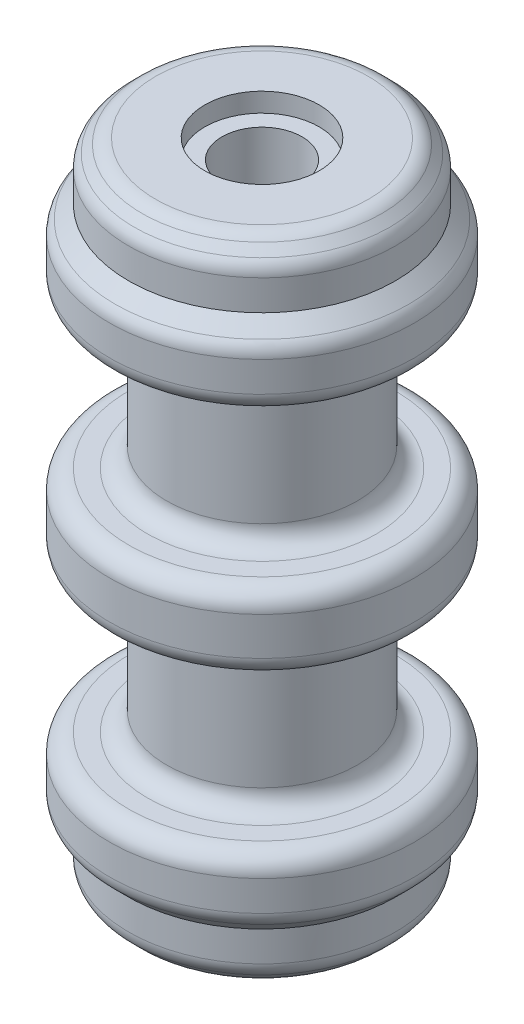
ISO-10303-21;
HEADER;
FILE_DESCRIPTION(('STEP AP214'),'2;1');
FILE_NAME('part.step','',(''),(''),'','','');
FILE_SCHEMA(('AUTOMOTIVE_DESIGN { 1 0 10303 214 1 1 1 1 }'));
ENDSEC;
DATA;
#1=APPLICATION_CONTEXT('core data for automotive mechanical design processes');
#2=APPLICATION_PROTOCOL_DEFINITION('international standard','automotive_design',2000,#1);
#3=PRODUCT_CONTEXT('',#1,'mechanical');
#4=PRODUCT('Part','Part','',(#3));
#5=PRODUCT_RELATED_PRODUCT_CATEGORY('part','',(#4));
#6=PRODUCT_DEFINITION_FORMATION('','',#4);
#7=PRODUCT_DEFINITION_CONTEXT('part definition',#1,'design');
#8=PRODUCT_DEFINITION('design','',#6,#7);
#9=PRODUCT_DEFINITION_SHAPE('','',#8);
#10=(LENGTH_UNIT() NAMED_UNIT(*) SI_UNIT(.MILLI.,.METRE.));
#11=(NAMED_UNIT(*) PLANE_ANGLE_UNIT() SI_UNIT($,.RADIAN.));
#12=(NAMED_UNIT(*) SI_UNIT($,.STERADIAN.) SOLID_ANGLE_UNIT());
#13=UNCERTAINTY_MEASURE_WITH_UNIT(LENGTH_MEASURE(1.E-05),#10,'distance_accuracy_value','');
#14=(GEOMETRIC_REPRESENTATION_CONTEXT(3) GLOBAL_UNCERTAINTY_ASSIGNED_CONTEXT((#13)) GLOBAL_UNIT_ASSIGNED_CONTEXT((#10,
#11,#12)) REPRESENTATION_CONTEXT('',''));
#15=CARTESIAN_POINT('',(0.,0.,0.));
#16=DIRECTION('',(0.,0.,1.));
#17=DIRECTION('',(1.,0.,0.));
#18=AXIS2_PLACEMENT_3D('',#15,#16,#17);
#19=CARTESIAN_POINT('',(0.,9.35000000000001,0.));
#20=DIRECTION('',(0.,-1.,0.));
#21=DIRECTION('',(1.,0.,0.));
#22=AXIS2_PLACEMENT_3D('',#19,#20,#21);
#23=CYLINDRICAL_SURFACE('',#22,4.);
#24=CARTESIAN_POINT('',(0.,0.5,0.));
#25=DIRECTION('',(0.,1.,0.));
#26=DIRECTION('',(-1.,0.,0.));
#27=AXIS2_PLACEMENT_3D('',#24,#25,#26);
#28=CIRCLE('',#27,4.);
#29=CARTESIAN_POINT('',(-4.,0.500000000000001,0.));
#30=VERTEX_POINT('',#29);
#31=EDGE_CURVE('E126',#30,#30,#28,.T.);
#32=ORIENTED_EDGE('',*,*,#31,.F.);
#33=EDGE_LOOP('',(#32));
#34=FACE_BOUND('',#33,.T.);
#35=CARTESIAN_POINT('',(0.,-0.5,0.));
#36=DIRECTION('',(0.,-1.,0.));
#37=DIRECTION('',(-1.,0.,0.));
#38=AXIS2_PLACEMENT_3D('',#35,#36,#37);
#39=CIRCLE('',#38,4.);
#40=CARTESIAN_POINT('',(-4.,-0.499999999999999,0.));
#41=VERTEX_POINT('',#40);
#42=EDGE_CURVE('E118',#41,#41,#39,.T.);
#43=ORIENTED_EDGE('',*,*,#42,.F.);
#44=EDGE_LOOP('',(#43));
#45=FACE_BOUND('',#44,.T.);
#46=ADVANCED_FACE('F16',(#34,#45),#23,.T.);
#47=CARTESIAN_POINT('',(0.,0.500000000000003,0.));
#48=DIRECTION('',(0.,-1.,0.));
#49=DIRECTION('',(1.,0.,0.));
#50=AXIS2_PLACEMENT_3D('',#47,#48,#49);
#51=TOROIDAL_SURFACE('',#50,3.5,0.499999999999999);
#52=ORIENTED_EDGE('',*,*,#31,.T.);
#53=EDGE_LOOP('',(#52));
#54=FACE_BOUND('',#53,.T.);
#55=CARTESIAN_POINT('',(0.,1.,0.));
#56=DIRECTION('',(0.,-1.,0.));
#57=DIRECTION('',(1.,0.,0.));
#58=AXIS2_PLACEMENT_3D('',#55,#56,#57);
#59=CIRCLE('',#58,3.5);
#60=CARTESIAN_POINT('',(3.5,1.,0.));
#61=VERTEX_POINT('',#60);
#62=EDGE_CURVE('E20',#61,#61,#59,.T.);
#63=ORIENTED_EDGE('',*,*,#62,.T.);
#64=EDGE_LOOP('',(#63));
#65=FACE_BOUND('',#64,.T.);
#66=ADVANCED_FACE('F558',(#54,#65),#51,.T.);
#67=CARTESIAN_POINT('',(0.,-0.500000000000003,0.));
#68=DIRECTION('',(0.,-1.,0.));
#69=DIRECTION('',(1.,0.,0.));
#70=AXIS2_PLACEMENT_3D('',#67,#68,#69);
#71=TOROIDAL_SURFACE('',#70,3.5,0.499999999999999);
#72=CARTESIAN_POINT('',(3.5,-1.,0.));
#73=CARTESIAN_POINT('',(3.49979766502808,-1.,0.667629423048145));
#74=CARTESIAN_POINT('',(3.2542590537185,-1.,1.28833148346657));
#75=CARTESIAN_POINT('',(2.98797828120489,-1.,1.96146807598652));
#76=CARTESIAN_POINT('',(2.47487373415291,-1.,2.47487373415292));
#77=CARTESIAN_POINT('',(1.96321095052489,-1.,2.98683678280856));
#78=CARTESIAN_POINT('',(1.28833148346655,-1.,3.25425905371851));
#79=CARTESIAN_POINT('',(0.668661707717994,-1.,3.4998043795635));
#80=CARTESIAN_POINT('',(0.,-1.,3.5));
#81=CARTESIAN_POINT('',(-0.666624940616947,-1.,3.50019502456976));
#82=CARTESIAN_POINT('',(-1.28833148346656,-1.,3.2542590537185));
#83=CARTESIAN_POINT('',(-1.96146808368726,-1.,2.9879782735099));
#84=CARTESIAN_POINT('',(-2.47487373415292,-1.,2.47487373415292));
#85=CARTESIAN_POINT('',(-2.98683669963696,-0.999999999999999,1.96321103364648));
#86=CARTESIAN_POINT('',(-3.2542590537185,-0.999999999999999,1.28833148346656));
#87=CARTESIAN_POINT('',(-3.49979734676479,-0.999999999999999,0.668679572420675));
#88=CARTESIAN_POINT('',(-3.5,-0.999999999999999,0.));
#89=B_SPLINE_CURVE_WITH_KNOTS('',2,(#72,#73,#74,#75,#76,#77,#78,#79,#80,#81,#82,#83,#84,#85,#86,
#87,#88),.UNSPECIFIED.,.F.,.F.,(3,2,2,2,2,2,2,2,3),(0.,0.125,0.25,0.375,0.5,0.625,0.75,0.875,
1.),.UNSPECIFIED.);
#90=CARTESIAN_POINT('',(3.5,-1.,0.));
#91=VERTEX_POINT('',#90);
#92=CARTESIAN_POINT('',(-3.5,-0.999999999999999,0.));
#93=VERTEX_POINT('',#92);
#94=EDGE_CURVE('E62',#91,#93,#89,.T.);
#95=ORIENTED_EDGE('',*,*,#94,.F.);
#96=CARTESIAN_POINT('',(-3.5,-0.999999999999999,0.));
#97=CARTESIAN_POINT('',(-3.49979766502809,-0.999999999999999,-0.667629423043126));
#98=CARTESIAN_POINT('',(-3.25425905371851,-0.999999999999999,-1.28833148346654));
#99=CARTESIAN_POINT('',(-2.98797828120803,-0.999999999999999,-1.96146807598399));
#100=CARTESIAN_POINT('',(-2.47487373415293,-1.,-2.4748737341529));
#101=CARTESIAN_POINT('',(-1.96321095052301,-1.,-2.98683678280983));
#102=CARTESIAN_POINT('',(-1.28833148346658,-1.,-3.2542590537185));
#103=CARTESIAN_POINT('',(-0.668661707717505,-1.,-3.49980437956322));
#104=CARTESIAN_POINT('',(0.,-1.,-3.5));
#105=CARTESIAN_POINT('',(0.666624940611165,-1.,-3.50019502457004));
#106=CARTESIAN_POINT('',(1.28833148346653,-1.,-3.25425905371852));
#107=CARTESIAN_POINT('',(1.9614680836811,-1.,-2.98797827351451));
#108=CARTESIAN_POINT('',(2.4748737341529,-1.,-2.47487373415293));
#109=CARTESIAN_POINT('',(2.98683669963715,-1.,-1.96321103364783));
#110=CARTESIAN_POINT('',(3.2542590537185,-1.,-1.28833148346657));
#111=CARTESIAN_POINT('',(3.49979734676479,-1.,-0.668679572418987));
#112=CARTESIAN_POINT('',(3.5,-1.,0.));
#113=B_SPLINE_CURVE_WITH_KNOTS('',2,(#96,#97,#98,#99,#100,#101,#102,#103,#104,#105,#106,#107,
#108,#109,#110,#111,#112),.UNSPECIFIED.,.F.,.F.,(3,2,2,2,2,2,2,2,3),(0.,0.125,0.25,0.375,0.5,
0.625,0.75,0.875,1.),.UNSPECIFIED.);
#114=EDGE_CURVE('E60',#93,#91,#113,.T.);
#115=ORIENTED_EDGE('',*,*,#114,.F.);
#116=EDGE_LOOP('',(#95,#115));
#117=FACE_BOUND('',#116,.T.);
#118=ORIENTED_EDGE('',*,*,#42,.T.);
#119=EDGE_LOOP('',(#118));
#120=FACE_BOUND('',#119,.T.);
#121=ADVANCED_FACE('F67',(#117,#120),#71,.T.);
#122=CARTESIAN_POINT('',(0.,1.,0.));
#123=DIRECTION('',(0.,-1.,0.));
#124=DIRECTION('',(1.,0.,0.));
#125=AXIS2_PLACEMENT_3D('',#122,#123,#124);
#126=PLANE('',#125);
#127=ORIENTED_EDGE('',*,*,#62,.F.);
#128=EDGE_LOOP('',(#127));
#129=FACE_BOUND('',#128,.T.);
#130=CARTESIAN_POINT('',(3.,0.999999999999999,0.));
#131=CARTESIAN_POINT('',(2.99979767576665,0.999999999999999,-0.572217428980286));
#132=CARTESIAN_POINT('',(2.78936490318729,1.,-1.10428412868562));
#133=CARTESIAN_POINT('',(2.56123034916773,1.,-1.68110872572008));
#134=CARTESIAN_POINT('',(2.12132034355965,1.,-2.12132034355963));
#135=CARTESIAN_POINT('',(1.68284906346665,1.,-2.56009224946141));
#136=CARTESIAN_POINT('',(1.10428412868563,1.,-2.78936490318728));
#137=CARTESIAN_POINT('',(0.573245088886783,1.,-2.99980408221013));
#138=CARTESIAN_POINT('',(0.,1.,-3.));
#139=CARTESIAN_POINT('',(-0.571213563804047,1.,-3.0001952234762));
#140=CARTESIAN_POINT('',(-1.10428412868561,1.,-2.7893649031873));
#141=CARTESIAN_POINT('',(-1.68110965453608,1.,-2.56122942098731));
#142=CARTESIAN_POINT('',(-2.12132034355964,1.,-2.12132034355965));
#143=CARTESIAN_POINT('',(-2.56009224946223,1.,-1.68284906346662));
#144=CARTESIAN_POINT('',(-2.78936490318729,1.,-1.10428412868562));
#145=CARTESIAN_POINT('',(-2.99979730636164,1.,-0.57326218760241));
#146=CARTESIAN_POINT('',(-3.,1.,0.));
#147=B_SPLINE_CURVE_WITH_KNOTS('',2,(#130,#131,#132,#133,#134,#135,#136,#137,#138,#139,#140,
#141,#142,#143,#144,#145,#146),.UNSPECIFIED.,.F.,.F.,(3,2,2,2,2,2,2,2,3),(0.,0.125,0.25,0.375,
0.5,0.625,0.75,0.875,1.),.UNSPECIFIED.);
#148=CARTESIAN_POINT('',(-3.,1.,0.));
#149=VERTEX_POINT('',#148);
#150=CARTESIAN_POINT('',(3.,0.999999999999999,0.));
#151=VERTEX_POINT('',#150);
#152=EDGE_CURVE('E69',#149,#151,#147,.F.);
#153=ORIENTED_EDGE('',*,*,#152,.T.);
#154=CARTESIAN_POINT('',(-3.,1.,0.));
#155=CARTESIAN_POINT('',(-2.99979767576666,1.,0.572217428980556));
#156=CARTESIAN_POINT('',(-2.78936490318729,1.,1.10428412868562));
#157=CARTESIAN_POINT('',(-2.56123034916822,1.,1.68110872571853));
#158=CARTESIAN_POINT('',(-2.12132034355965,1.,2.12132034355964));
#159=CARTESIAN_POINT('',(-1.68284906346669,1.,2.56009224946243));
#160=CARTESIAN_POINT('',(-1.10428412868563,1.,2.78936490318729));
#161=CARTESIAN_POINT('',(-0.573245088884399,1.,2.99980408221012));
#162=CARTESIAN_POINT('',(0.,1.,3.));
#163=CARTESIAN_POINT('',(0.571213563804764,1.,3.0001952234762));
#164=CARTESIAN_POINT('',(1.10428412868561,1.,2.78936490318729));
#165=CARTESIAN_POINT('',(1.68110965453616,1.,2.56122942098697));
#166=CARTESIAN_POINT('',(2.12132034355964,1.,2.12132034355965));
#167=CARTESIAN_POINT('',(2.56009224946023,1.,1.68284906346889));
#168=CARTESIAN_POINT('',(2.78936490318729,1.,1.10428412868562));
#169=CARTESIAN_POINT('',(2.99979730636164,0.999999999999999,0.573262187604982));
#170=CARTESIAN_POINT('',(3.,0.999999999999999,0.));
#171=B_SPLINE_CURVE_WITH_KNOTS('',2,(#154,#155,#156,#157,#158,#159,#160,#161,#162,#163,#164,
#165,#166,#167,#168,#169,#170),.UNSPECIFIED.,.F.,.F.,(3,2,2,2,2,2,2,2,3),(0.,0.125,0.25,0.375,
0.5,0.625,0.75,0.875,1.),.UNSPECIFIED.);
#172=EDGE_CURVE('E72',#151,#149,#171,.F.);
#173=ORIENTED_EDGE('',*,*,#172,.T.);
#174=EDGE_LOOP('',(#153,#173));
#175=FACE_BOUND('',#174,.T.);
#176=ADVANCED_FACE('F90',(#129,#175),#126,.F.);
#177=CARTESIAN_POINT('',(0.,-1.,0.));
#178=DIRECTION('',(0.,-1.,0.));
#179=DIRECTION('',(1.,0.,0.));
#180=AXIS2_PLACEMENT_3D('',#177,#178,#179);
#181=PLANE('',#180);
#182=ORIENTED_EDGE('',*,*,#94,.T.);
#183=ORIENTED_EDGE('',*,*,#114,.T.);
#184=EDGE_LOOP('',(#182,#183));
#185=FACE_BOUND('',#184,.T.);
#186=CARTESIAN_POINT('',(3.,-1.,0.));
#187=CARTESIAN_POINT('',(2.99979766148926,-1.,-0.572257808609179));
#188=CARTESIAN_POINT('',(2.78936490318729,-1.,-1.10428412868563));
#189=CARTESIAN_POINT('',(2.56120151893657,-1.,-1.6811378784469));
#190=CARTESIAN_POINT('',(2.12132034355963,-1.,-2.12132034355965));
#191=CARTESIAN_POINT('',(1.68288156317682,-1.,-2.56005942573238));
#192=CARTESIAN_POINT('',(1.1042841286856,-1.,-2.7893649031873));
#193=CARTESIAN_POINT('',(0.57329084618843,-1.,-2.99980425343336));
#194=CARTESIAN_POINT('',(0.,-1.,-3.));
#195=CARTESIAN_POINT('',(-0.571253116957725,-1.,-3.00019505079677));
#196=CARTESIAN_POINT('',(-1.10428412868563,-1.,-2.78936490318728));
#197=CARTESIAN_POINT('',(-1.68113788361893,-1.,-2.56120151376755));
#198=CARTESIAN_POINT('',(-2.12132034355965,-1.,-2.12132034355963));
#199=CARTESIAN_POINT('',(-2.5600593261593,-1.,-1.68288166268227));
#200=CARTESIAN_POINT('',(-2.78936490318729,-1.,-1.10428412868561));
#201=CARTESIAN_POINT('',(-2.99979728996671,-0.999999999999999,-0.573308556082177));
#202=CARTESIAN_POINT('',(-3.,-0.999999999999999,0.));
#203=B_SPLINE_CURVE_WITH_KNOTS('',2,(#186,#187,#188,#189,#190,#191,#192,#193,#194,#195,#196,
#197,#198,#199,#200,#201,#202),.UNSPECIFIED.,.F.,.F.,(3,2,2,2,2,2,2,2,3),(0.,0.125,0.25,0.375,
0.5,0.625,0.75,0.875,1.),.UNSPECIFIED.);
#204=CARTESIAN_POINT('',(3.,-1.,0.));
#205=VERTEX_POINT('',#204);
#206=CARTESIAN_POINT('',(-3.,-0.999999999999999,0.));
#207=VERTEX_POINT('',#206);
#208=EDGE_CURVE('E98',#205,#207,#203,.T.);
#209=ORIENTED_EDGE('',*,*,#208,.T.);
#210=CARTESIAN_POINT('',(-3.,-0.999999999999999,0.));
#211=CARTESIAN_POINT('',(-2.99979766148926,-0.999999999999999,0.572257808610895));
#212=CARTESIAN_POINT('',(-2.78936490318729,-1.,1.10428412868561));
#213=CARTESIAN_POINT('',(-2.56120151893553,-1.,1.68113787844767));
#214=CARTESIAN_POINT('',(-2.12132034355964,-1.,2.12132034355964));
#215=CARTESIAN_POINT('',(-1.68288156317603,-1.,2.56005942573343));
#216=CARTESIAN_POINT('',(-1.10428412868562,-1.,2.78936490318729));
#217=CARTESIAN_POINT('',(-0.573290846186715,-1.,2.99980425343336));
#218=CARTESIAN_POINT('',(0.,-1.,3.));
#219=CARTESIAN_POINT('',(0.571253116959211,-1.,3.00019505079677));
#220=CARTESIAN_POINT('',(1.10428412868562,-1.,2.78936490318729));
#221=CARTESIAN_POINT('',(1.68113788361955,-1.,2.56120151376667));
#222=CARTESIAN_POINT('',(2.12132034355964,-1.,2.12132034355964));
#223=CARTESIAN_POINT('',(2.56005932615825,-1.,1.68288166268358));
#224=CARTESIAN_POINT('',(2.78936490318729,-1.,1.10428412868562));
#225=CARTESIAN_POINT('',(2.99979728996671,-1.,0.573308556083399));
#226=CARTESIAN_POINT('',(3.,-1.,0.));
#227=B_SPLINE_CURVE_WITH_KNOTS('',2,(#210,#211,#212,#213,#214,#215,#216,#217,#218,#219,#220,
#221,#222,#223,#224,#225,#226),.UNSPECIFIED.,.F.,.F.,(3,2,2,2,2,2,2,2,3),(0.,0.125,0.25,0.375,
0.5,0.625,0.75,0.875,1.),.UNSPECIFIED.);
#228=EDGE_CURVE('E102',#207,#205,#227,.T.);
#229=ORIENTED_EDGE('',*,*,#228,.T.);
#230=EDGE_LOOP('',(#209,#229));
#231=FACE_BOUND('',#230,.T.);
#232=ADVANCED_FACE('F63',(#185,#231),#181,.T.);
#233=CARTESIAN_POINT('',(0.,1.5,0.));
#234=DIRECTION('',(0.,-1.,0.));
#235=DIRECTION('',(1.,0.,0.));
#236=AXIS2_PLACEMENT_3D('',#233,#234,#235);
#237=TOROIDAL_SURFACE('',#236,3.,0.499999999999999);
#238=CARTESIAN_POINT('',(0.,1.50000000000001,0.));
#239=DIRECTION('',(0.,-1.,0.));
#240=DIRECTION('',(1.,0.,0.));
#241=AXIS2_PLACEMENT_3D('',#238,#239,#240);
#242=CIRCLE('',#241,2.5);
#243=CARTESIAN_POINT('',(2.5,1.50000000000001,0.));
#244=VERTEX_POINT('',#243);
#245=EDGE_CURVE('E105',#244,#244,#242,.F.);
#246=ORIENTED_EDGE('',*,*,#245,.F.);
#247=EDGE_LOOP('',(#246));
#248=FACE_BOUND('',#247,.T.);
#249=ORIENTED_EDGE('',*,*,#152,.F.);
#250=ORIENTED_EDGE('',*,*,#172,.F.);
#251=EDGE_LOOP('',(#249,#250));
#252=FACE_BOUND('',#251,.T.);
#253=ADVANCED_FACE('F89',(#248,#252),#237,.F.);
#254=CARTESIAN_POINT('',(0.,-1.5,0.));
#255=DIRECTION('',(0.,-1.,0.));
#256=DIRECTION('',(1.,0.,0.));
#257=AXIS2_PLACEMENT_3D('',#254,#255,#256);
#258=TOROIDAL_SURFACE('',#257,3.,0.499999999999999);
#259=ORIENTED_EDGE('',*,*,#228,.F.);
#260=ORIENTED_EDGE('',*,*,#208,.F.);
#261=EDGE_LOOP('',(#259,#260));
#262=FACE_BOUND('',#261,.T.);
#263=CARTESIAN_POINT('',(0.,-1.5,0.));
#264=DIRECTION('',(0.,-1.,0.));
#265=DIRECTION('',(1.,0.,0.));
#266=AXIS2_PLACEMENT_3D('',#263,#264,#265);
#267=CIRCLE('',#266,2.5);
#268=CARTESIAN_POINT('',(2.5,-1.5,0.));
#269=VERTEX_POINT('',#268);
#270=EDGE_CURVE('E113',#269,#269,#267,.T.);
#271=ORIENTED_EDGE('',*,*,#270,.F.);
#272=EDGE_LOOP('',(#271));
#273=FACE_BOUND('',#272,.T.);
#274=ADVANCED_FACE('F192',(#262,#273),#258,.F.);
#275=CARTESIAN_POINT('',(0.,9.35000000000001,0.));
#276=DIRECTION('',(0.,-1.,0.));
#277=DIRECTION('',(1.,0.,0.));
#278=AXIS2_PLACEMENT_3D('',#275,#276,#277);
#279=CYLINDRICAL_SURFACE('',#278,2.5);
#280=ORIENTED_EDGE('',*,*,#245,.T.);
#281=EDGE_LOOP('',(#280));
#282=FACE_BOUND('',#281,.T.);
#283=CARTESIAN_POINT('',(0.,4.50000000000001,0.));
#284=DIRECTION('',(0.,-1.,0.));
#285=DIRECTION('',(1.,0.,0.));
#286=AXIS2_PLACEMENT_3D('',#283,#284,#285);
#287=CIRCLE('',#286,2.5);
#288=CARTESIAN_POINT('',(2.5,4.5,0.));
#289=VERTEX_POINT('',#288);
#290=EDGE_CURVE('E599',#289,#289,#287,.T.);
#291=ORIENTED_EDGE('',*,*,#290,.T.);
#292=EDGE_LOOP('',(#291));
#293=FACE_BOUND('',#292,.T.);
#294=ADVANCED_FACE('F91',(#282,#293),#279,.T.);
#295=CARTESIAN_POINT('',(0.,9.35000000000001,0.));
#296=DIRECTION('',(0.,-1.,0.));
#297=DIRECTION('',(1.,0.,0.));
#298=AXIS2_PLACEMENT_3D('',#295,#296,#297);
#299=CYLINDRICAL_SURFACE('',#298,2.5);
#300=CARTESIAN_POINT('',(0.,-4.5,0.));
#301=DIRECTION('',(0.,1.,0.));
#302=DIRECTION('',(1.,0.,0.));
#303=AXIS2_PLACEMENT_3D('',#300,#301,#302);
#304=CIRCLE('',#303,2.5);
#305=CARTESIAN_POINT('',(2.5,-4.5,0.));
#306=VERTEX_POINT('',#305);
#307=EDGE_CURVE('E159',#306,#306,#304,.T.);
#308=ORIENTED_EDGE('',*,*,#307,.T.);
#309=EDGE_LOOP('',(#308));
#310=FACE_BOUND('',#309,.T.);
#311=ORIENTED_EDGE('',*,*,#270,.T.);
#312=EDGE_LOOP('',(#311));
#313=FACE_BOUND('',#312,.T.);
#314=ADVANCED_FACE('F180',(#310,#313),#299,.T.);
#315=CARTESIAN_POINT('',(0.,4.5,0.));
#316=DIRECTION('',(0.,-1.,0.));
#317=DIRECTION('',(1.,0.,0.));
#318=AXIS2_PLACEMENT_3D('',#315,#316,#317);
#319=TOROIDAL_SURFACE('',#318,3.,0.5);
#320=CARTESIAN_POINT('',(-3.,5.,0.));
#321=CARTESIAN_POINT('',(-2.99979766148926,5.,0.572257808609255));
#322=CARTESIAN_POINT('',(-2.78936490318729,5.,1.10428412868561));
#323=CARTESIAN_POINT('',(-2.56120151893685,5.,1.68113787844608));
#324=CARTESIAN_POINT('',(-2.12132034355965,5.,2.12132034355963));
#325=CARTESIAN_POINT('',(-1.68288156317594,5.,2.56005942573378));
#326=CARTESIAN_POINT('',(-1.10428412868563,5.,2.78936490318728));
#327=CARTESIAN_POINT('',(-0.573290846186591,5.,2.99980425343311));
#328=CARTESIAN_POINT('',(0.,5.,3.));
#329=CARTESIAN_POINT('',(0.571253116958348,5.,3.00019505079701));
#330=CARTESIAN_POINT('',(1.10428412868561,5.,2.78936490318729));
#331=CARTESIAN_POINT('',(1.68113788362024,5.,2.5612015137665));
#332=CARTESIAN_POINT('',(2.12132034355964,5.,2.12132034355965));
#333=CARTESIAN_POINT('',(2.56005932615782,5.,1.68288166268348));
#334=CARTESIAN_POINT('',(2.78936490318729,5.,1.10428412868562));
#335=CARTESIAN_POINT('',(2.99979728996671,5.,0.57330855608449));
#336=CARTESIAN_POINT('',(3.,5.,0.));
#337=B_SPLINE_CURVE_WITH_KNOTS('',2,(#320,#321,#322,#323,#324,#325,#326,#327,#328,#329,#330,
#331,#332,#333,#334,#335,#336),.UNSPECIFIED.,.F.,.F.,(3,2,2,2,2,2,2,2,3),(0.,0.125,0.25,0.375,
0.5,0.625,0.75,0.875,1.),.UNSPECIFIED.);
#338=CARTESIAN_POINT('',(-3.,5.,0.));
#339=VERTEX_POINT('',#338);
#340=CARTESIAN_POINT('',(3.,5.,0.));
#341=VERTEX_POINT('',#340);
#342=EDGE_CURVE('E151',#339,#341,#337,.T.);
#343=ORIENTED_EDGE('',*,*,#342,.F.);
#344=CARTESIAN_POINT('',(3.,5.,0.));
#345=CARTESIAN_POINT('',(2.99979766148926,5.,-0.572257808609184));
#346=CARTESIAN_POINT('',(2.78936490318729,5.,-1.10428412868563));
#347=CARTESIAN_POINT('',(2.56120151893639,5.,-1.68113787844734));
#348=CARTESIAN_POINT('',(2.12132034355963,5.,-2.12132034355965));
#349=CARTESIAN_POINT('',(1.68288156317699,5.,-2.56005942573194));
#350=CARTESIAN_POINT('',(1.1042841286856,5.,-2.7893649031873));
#351=CARTESIAN_POINT('',(0.573290846189895,5.,-2.99980425343311));
#352=CARTESIAN_POINT('',(0.,5.,-3.));
#353=CARTESIAN_POINT('',(-0.571253116957728,5.,-3.00019505079701));
#354=CARTESIAN_POINT('',(-1.10428412868564,5.,-2.78936490318728));
#355=CARTESIAN_POINT('',(-1.68113788362068,5.,-2.56120151376659));
#356=CARTESIAN_POINT('',(-2.12132034355965,5.,-2.12132034355963));
#357=CARTESIAN_POINT('',(-2.56005932616016,5.,-1.68288166268061));
#358=CARTESIAN_POINT('',(-2.78936490318729,5.,-1.10428412868561));
#359=CARTESIAN_POINT('',(-2.99979728996671,5.,-0.573308556081701));
#360=CARTESIAN_POINT('',(-3.,5.,0.));
#361=B_SPLINE_CURVE_WITH_KNOTS('',2,(#344,#345,#346,#347,#348,#349,#350,#351,#352,#353,#354,
#355,#356,#357,#358,#359,#360),.UNSPECIFIED.,.F.,.F.,(3,2,2,2,2,2,2,2,3),(0.,0.125,0.25,0.375,
0.5,0.625,0.75,0.875,1.),.UNSPECIFIED.);
#362=EDGE_CURVE('E154',#341,#339,#361,.T.);
#363=ORIENTED_EDGE('',*,*,#362,.F.);
#364=EDGE_LOOP('',(#343,#363));
#365=FACE_BOUND('',#364,.T.);
#366=ORIENTED_EDGE('',*,*,#290,.F.);
#367=EDGE_LOOP('',(#366));
#368=FACE_BOUND('',#367,.T.);
#369=ADVANCED_FACE('F183',(#365,#368),#319,.F.);
#370=CARTESIAN_POINT('',(0.,-4.5,0.));
#371=DIRECTION('',(0.,-1.,0.));
#372=DIRECTION('',(1.,0.,0.));
#373=AXIS2_PLACEMENT_3D('',#370,#371,#372);
#374=TOROIDAL_SURFACE('',#373,3.,0.499999999999999);
#375=ORIENTED_EDGE('',*,*,#307,.F.);
#376=EDGE_LOOP('',(#375));
#377=FACE_BOUND('',#376,.T.);
#378=CARTESIAN_POINT('',(0.,-5.,0.));
#379=DIRECTION('',(0.,-1.,0.));
#380=DIRECTION('',(1.,0.,0.));
#381=AXIS2_PLACEMENT_3D('',#378,#379,#380);
#382=CIRCLE('',#381,3.);
#383=CARTESIAN_POINT('',(3.,-5.,0.));
#384=VERTEX_POINT('',#383);
#385=EDGE_CURVE('E149',#384,#384,#382,.F.);
#386=ORIENTED_EDGE('',*,*,#385,.T.);
#387=EDGE_LOOP('',(#386));
#388=FACE_BOUND('',#387,.T.);
#389=ADVANCED_FACE('F177',(#377,#388),#374,.F.);
#390=CARTESIAN_POINT('',(0.,5.,0.));
#391=DIRECTION('',(0.,-1.,0.));
#392=DIRECTION('',(1.,0.,0.));
#393=AXIS2_PLACEMENT_3D('',#390,#391,#392);
#394=PLANE('',#393);
#395=CARTESIAN_POINT('',(0.,5.,0.));
#396=DIRECTION('',(0.,-1.,0.));
#397=DIRECTION('',(1.,0.,0.));
#398=AXIS2_PLACEMENT_3D('',#395,#396,#397);
#399=CIRCLE('',#398,3.5);
#400=CARTESIAN_POINT('',(3.5,5.,0.));
#401=VERTEX_POINT('',#400);
#402=EDGE_CURVE('E147',#401,#401,#399,.F.);
#403=ORIENTED_EDGE('',*,*,#402,.F.);
#404=EDGE_LOOP('',(#403));
#405=FACE_BOUND('',#404,.T.);
#406=ORIENTED_EDGE('',*,*,#362,.T.);
#407=ORIENTED_EDGE('',*,*,#342,.T.);
#408=EDGE_LOOP('',(#406,#407));
#409=FACE_BOUND('',#408,.T.);
#410=ADVANCED_FACE('F167',(#405,#409),#394,.T.);
#411=CARTESIAN_POINT('',(0.,-5.,0.));
#412=DIRECTION('',(0.,-1.,0.));
#413=DIRECTION('',(1.,0.,0.));
#414=AXIS2_PLACEMENT_3D('',#411,#412,#413);
#415=PLANE('',#414);
#416=CARTESIAN_POINT('',(0.,-5.,0.));
#417=DIRECTION('',(0.,-1.,0.));
#418=DIRECTION('',(1.,0.,0.));
#419=AXIS2_PLACEMENT_3D('',#416,#417,#418);
#420=CIRCLE('',#419,3.5);
#421=CARTESIAN_POINT('',(3.5,-5.,0.));
#422=VERTEX_POINT('',#421);
#423=EDGE_CURVE('E143',#422,#422,#420,.T.);
#424=ORIENTED_EDGE('',*,*,#423,.F.);
#425=EDGE_LOOP('',(#424));
#426=FACE_BOUND('',#425,.T.);
#427=ORIENTED_EDGE('',*,*,#385,.F.);
#428=EDGE_LOOP('',(#427));
#429=FACE_BOUND('',#428,.T.);
#430=ADVANCED_FACE('F176',(#426,#429),#415,.F.);
#431=CARTESIAN_POINT('',(0.,5.5,0.));
#432=DIRECTION('',(0.,-1.,0.));
#433=DIRECTION('',(1.,0.,0.));
#434=AXIS2_PLACEMENT_3D('',#431,#432,#433);
#435=TOROIDAL_SURFACE('',#434,3.5,0.5);
#436=ORIENTED_EDGE('',*,*,#402,.T.);
#437=EDGE_LOOP('',(#436));
#438=FACE_BOUND('',#437,.T.);
#439=CARTESIAN_POINT('',(0.,5.5,0.));
#440=DIRECTION('',(0.,-1.,0.));
#441=DIRECTION('',(1.,0.,0.));
#442=AXIS2_PLACEMENT_3D('',#439,#440,#441);
#443=CIRCLE('',#442,4.);
#444=CARTESIAN_POINT('',(4.,5.5,0.));
#445=VERTEX_POINT('',#444);
#446=EDGE_CURVE('E146',#445,#445,#443,.F.);
#447=ORIENTED_EDGE('',*,*,#446,.F.);
#448=EDGE_LOOP('',(#447));
#449=FACE_BOUND('',#448,.T.);
#450=ADVANCED_FACE('F295',(#438,#449),#435,.T.);
#451=CARTESIAN_POINT('',(0.,-5.5,0.));
#452=DIRECTION('',(0.,-1.,0.));
#453=DIRECTION('',(1.,0.,0.));
#454=AXIS2_PLACEMENT_3D('',#451,#452,#453);
#455=TOROIDAL_SURFACE('',#454,3.5,0.500000000000001);
#456=CARTESIAN_POINT('',(0.,-5.49999999999999,0.));
#457=DIRECTION('',(0.,-1.,0.));
#458=DIRECTION('',(1.,0.,0.));
#459=AXIS2_PLACEMENT_3D('',#456,#457,#458);
#460=CIRCLE('',#459,4.);
#461=CARTESIAN_POINT('',(4.,-5.5,0.));
#462=VERTEX_POINT('',#461);
#463=EDGE_CURVE('E288',#462,#462,#460,.T.);
#464=ORIENTED_EDGE('',*,*,#463,.F.);
#465=EDGE_LOOP('',(#464));
#466=FACE_BOUND('',#465,.T.);
#467=ORIENTED_EDGE('',*,*,#423,.T.);
#468=EDGE_LOOP('',(#467));
#469=FACE_BOUND('',#468,.T.);
#470=ADVANCED_FACE('F297',(#466,#469),#455,.T.);
#471=CARTESIAN_POINT('',(0.,9.35000000000001,0.));
#472=DIRECTION('',(0.,-1.,0.));
#473=DIRECTION('',(1.,0.,0.));
#474=AXIS2_PLACEMENT_3D('',#471,#472,#473);
#475=CYLINDRICAL_SURFACE('',#474,4.);
#476=CARTESIAN_POINT('',(0.,6.29289321881345,0.));
#477=DIRECTION('',(0.,1.,0.));
#478=DIRECTION('',(-1.,0.,0.));
#479=AXIS2_PLACEMENT_3D('',#476,#477,#478);
#480=CIRCLE('',#479,4.);
#481=CARTESIAN_POINT('',(-4.,6.29289321881345,0.));
#482=VERTEX_POINT('',#481);
#483=EDGE_CURVE('E285',#482,#482,#480,.T.);
#484=ORIENTED_EDGE('',*,*,#483,.F.);
#485=EDGE_LOOP('',(#484));
#486=FACE_BOUND('',#485,.T.);
#487=ORIENTED_EDGE('',*,*,#446,.T.);
#488=EDGE_LOOP('',(#487));
#489=FACE_BOUND('',#488,.T.);
#490=ADVANCED_FACE('F293',(#486,#489),#475,.T.);
#491=CARTESIAN_POINT('',(0.,9.35000000000001,0.));
#492=DIRECTION('',(0.,-1.,0.));
#493=DIRECTION('',(1.,0.,0.));
#494=AXIS2_PLACEMENT_3D('',#491,#492,#493);
#495=CYLINDRICAL_SURFACE('',#494,4.);
#496=ORIENTED_EDGE('',*,*,#463,.T.);
#497=EDGE_LOOP('',(#496));
#498=FACE_BOUND('',#497,.T.);
#499=CARTESIAN_POINT('',(0.,-6.29289321881346,0.));
#500=DIRECTION('',(0.,-1.,0.));
#501=DIRECTION('',(-1.,0.,0.));
#502=AXIS2_PLACEMENT_3D('',#499,#500,#501);
#503=CIRCLE('',#502,4.);
#504=CARTESIAN_POINT('',(-4.,-6.29289321881346,0.));
#505=VERTEX_POINT('',#504);
#506=EDGE_CURVE('E282',#505,#505,#503,.T.);
#507=ORIENTED_EDGE('',*,*,#506,.F.);
#508=EDGE_LOOP('',(#507));
#509=FACE_BOUND('',#508,.T.);
#510=ADVANCED_FACE('F313',(#498,#509),#495,.T.);
#511=CARTESIAN_POINT('',(0.,6.29289321881345,0.));
#512=DIRECTION('',(0.,-1.,0.));
#513=DIRECTION('',(1.,0.,0.));
#514=AXIS2_PLACEMENT_3D('',#511,#512,#513);
#515=TOROIDAL_SURFACE('',#514,3.50000000000001,0.499999999999994);
#516=ORIENTED_EDGE('',*,*,#483,.T.);
#517=EDGE_LOOP('',(#516));
#518=FACE_BOUND('',#517,.T.);
#519=CARTESIAN_POINT('',(0.,6.64644660940894,0.));
#520=DIRECTION('',(0.,-1.,0.));
#521=DIRECTION('',(1.,0.,0.));
#522=AXIS2_PLACEMENT_3D('',#519,#520,#521);
#523=CIRCLE('',#522,3.8535533905133);
#524=CARTESIAN_POINT('',(3.8535533905133,6.64644660940894,0.));
#525=VERTEX_POINT('',#524);
#526=EDGE_CURVE('E279',#525,#525,#523,.F.);
#527=ORIENTED_EDGE('',*,*,#526,.F.);
#528=EDGE_LOOP('',(#527));
#529=FACE_BOUND('',#528,.T.);
#530=ADVANCED_FACE('F309',(#518,#529),#515,.T.);
#531=CARTESIAN_POINT('',(0.,-6.29289321881346,0.));
#532=DIRECTION('',(0.,-1.,0.));
#533=DIRECTION('',(1.,0.,0.));
#534=AXIS2_PLACEMENT_3D('',#531,#532,#533);
#535=TOROIDAL_SURFACE('',#534,3.50000000000002,0.499999999999988);
#536=CARTESIAN_POINT('',(0.,-6.64644660946578,0.));
#537=DIRECTION('',(0.,1.,0.));
#538=DIRECTION('',(-1.,0.,0.));
#539=AXIS2_PLACEMENT_3D('',#536,#537,#538);
#540=CIRCLE('',#539,3.85355339057014);
#541=CARTESIAN_POINT('',(-3.85355339057014,-6.64644660946578,0.));
#542=VERTEX_POINT('',#541);
#543=EDGE_CURVE('E276',#542,#542,#540,.F.);
#544=ORIENTED_EDGE('',*,*,#543,.F.);
#545=EDGE_LOOP('',(#544));
#546=FACE_BOUND('',#545,.T.);
#547=ORIENTED_EDGE('',*,*,#506,.T.);
#548=EDGE_LOOP('',(#547));
#549=FACE_BOUND('',#548,.T.);
#550=ADVANCED_FACE('F312',(#546,#549),#535,.T.);
#551=CARTESIAN_POINT('',(0.,6.64644660940894,0.));
#552=DIRECTION('',(0.,-1.,0.));
#553=DIRECTION('',(1.,0.,0.));
#554=AXIS2_PLACEMENT_3D('',#551,#552,#553);
#555=CONICAL_SURFACE('',#554,3.8535533905133,0.785398163477837);
#556=CARTESIAN_POINT('',(0.,7.,0.));
#557=DIRECTION('',(0.,-1.,0.));
#558=DIRECTION('',(1.,0.,0.));
#559=AXIS2_PLACEMENT_3D('',#556,#557,#558);
#560=CIRCLE('',#559,3.5);
#561=CARTESIAN_POINT('',(3.5,7.,0.));
#562=VERTEX_POINT('',#561);
#563=EDGE_CURVE('E273',#562,#562,#560,.F.);
#564=ORIENTED_EDGE('',*,*,#563,.F.);
#565=EDGE_LOOP('',(#564));
#566=FACE_BOUND('',#565,.T.);
#567=ORIENTED_EDGE('',*,*,#526,.T.);
#568=EDGE_LOOP('',(#567));
#569=FACE_BOUND('',#568,.T.);
#570=ADVANCED_FACE('F317',(#566,#569),#555,.T.);
#571=CARTESIAN_POINT('',(0.,-6.64644660952263,0.));
#572=DIRECTION('',(0.,1.,0.));
#573=DIRECTION('',(-1.,0.,0.));
#574=AXIS2_PLACEMENT_3D('',#571,#572,#573);
#575=CONICAL_SURFACE('',#574,3.85355339045645,0.78539816339745);
#576=CARTESIAN_POINT('',(0.,-7.,0.));
#577=DIRECTION('',(0.,-1.,0.));
#578=DIRECTION('',(1.,0.,0.));
#579=AXIS2_PLACEMENT_3D('',#576,#577,#578);
#580=CIRCLE('',#579,3.5);
#581=CARTESIAN_POINT('',(3.5,-7.,0.));
#582=VERTEX_POINT('',#581);
#583=EDGE_CURVE('E270',#582,#582,#580,.T.);
#584=ORIENTED_EDGE('',*,*,#583,.F.);
#585=EDGE_LOOP('',(#584));
#586=FACE_BOUND('',#585,.T.);
#587=ORIENTED_EDGE('',*,*,#543,.T.);
#588=EDGE_LOOP('',(#587));
#589=FACE_BOUND('',#588,.T.);
#590=ADVANCED_FACE('F344',(#586,#589),#575,.T.);
#591=CARTESIAN_POINT('',(0.,9.35000000000001,0.));
#592=DIRECTION('',(0.,-1.,0.));
#593=DIRECTION('',(1.,0.,0.));
#594=AXIS2_PLACEMENT_3D('',#591,#592,#593);
#595=CYLINDRICAL_SURFACE('',#594,3.5);
#596=CARTESIAN_POINT('',(0.,7.79289321881346,0.));
#597=DIRECTION('',(0.,1.,0.));
#598=DIRECTION('',(-1.,0.,0.));
#599=AXIS2_PLACEMENT_3D('',#596,#597,#598);
#600=CIRCLE('',#599,3.5);
#601=CARTESIAN_POINT('',(-3.5,7.79289321881346,0.));
#602=VERTEX_POINT('',#601);
#603=EDGE_CURVE('E267',#602,#602,#600,.T.);
#604=ORIENTED_EDGE('',*,*,#603,.F.);
#605=EDGE_LOOP('',(#604));
#606=FACE_BOUND('',#605,.T.);
#607=ORIENTED_EDGE('',*,*,#563,.T.);
#608=EDGE_LOOP('',(#607));
#609=FACE_BOUND('',#608,.T.);
#610=ADVANCED_FACE('F338',(#606,#609),#595,.T.);
#611=CARTESIAN_POINT('',(0.,9.35000000000001,0.));
#612=DIRECTION('',(0.,-1.,0.));
#613=DIRECTION('',(1.,0.,0.));
#614=AXIS2_PLACEMENT_3D('',#611,#612,#613);
#615=CYLINDRICAL_SURFACE('',#614,3.5);
#616=ORIENTED_EDGE('',*,*,#583,.T.);
#617=EDGE_LOOP('',(#616));
#618=FACE_BOUND('',#617,.T.);
#619=CARTESIAN_POINT('',(0.,-7.79289321881346,0.));
#620=DIRECTION('',(0.,-1.,0.));
#621=DIRECTION('',(-1.,0.,0.));
#622=AXIS2_PLACEMENT_3D('',#619,#620,#621);
#623=CIRCLE('',#622,3.5);
#624=CARTESIAN_POINT('',(-3.5,-7.79289321881346,0.));
#625=VERTEX_POINT('',#624);
#626=EDGE_CURVE('E264',#625,#625,#623,.T.);
#627=ORIENTED_EDGE('',*,*,#626,.F.);
#628=EDGE_LOOP('',(#627));
#629=FACE_BOUND('',#628,.T.);
#630=ADVANCED_FACE('F323',(#618,#629),#615,.T.);
#631=CARTESIAN_POINT('',(0.,7.79289321881346,0.));
#632=DIRECTION('',(0.,-1.,0.));
#633=DIRECTION('',(1.,0.,0.));
#634=AXIS2_PLACEMENT_3D('',#631,#632,#633);
#635=TOROIDAL_SURFACE('',#634,3.00000000000001,0.499999999999995);
#636=ORIENTED_EDGE('',*,*,#603,.T.);
#637=EDGE_LOOP('',(#636));
#638=FACE_BOUND('',#637,.T.);
#639=CARTESIAN_POINT('',(0.,8.14644660948716,0.));
#640=DIRECTION('',(0.,-1.,0.));
#641=DIRECTION('',(1.,0.,0.));
#642=AXIS2_PLACEMENT_3D('',#639,#640,#641);
#643=CIRCLE('',#642,3.35355339063881);
#644=CARTESIAN_POINT('',(3.35355339063881,8.14644660948716,0.));
#645=VERTEX_POINT('',#644);
#646=EDGE_CURVE('E261',#645,#645,#643,.F.);
#647=ORIENTED_EDGE('',*,*,#646,.F.);
#648=EDGE_LOOP('',(#647));
#649=FACE_BOUND('',#648,.T.);
#650=ADVANCED_FACE('F319',(#638,#649),#635,.T.);
#651=CARTESIAN_POINT('',(0.,-7.79289321881346,0.));
#652=DIRECTION('',(0.,-1.,0.));
#653=DIRECTION('',(0.,0.,-1.));
#654=AXIS2_PLACEMENT_3D('',#651,#652,#653);
#655=TOROIDAL_SURFACE('',#654,3.,0.499999999999998);
#656=CARTESIAN_POINT('',(0.,-8.14644660948716,0.));
#657=DIRECTION('',(0.,1.,0.));
#658=DIRECTION('',(-1.,0.,0.));
#659=AXIS2_PLACEMENT_3D('',#656,#657,#658);
#660=CIRCLE('',#659,3.35355339063881);
#661=CARTESIAN_POINT('',(-3.35355339063881,-8.14644660948716,0.));
#662=VERTEX_POINT('',#661);
#663=EDGE_CURVE('E256',#662,#662,#660,.F.);
#664=ORIENTED_EDGE('',*,*,#663,.F.);
#665=EDGE_LOOP('',(#664));
#666=FACE_BOUND('',#665,.T.);
#667=ORIENTED_EDGE('',*,*,#626,.T.);
#668=EDGE_LOOP('',(#667));
#669=FACE_BOUND('',#668,.T.);
#670=ADVANCED_FACE('F322',(#666,#669),#655,.T.);
#671=CARTESIAN_POINT('',(0.,8.14644660931663,0.));
#672=DIRECTION('',(0.,-1.,0.));
#673=DIRECTION('',(1.,0.,0.));
#674=AXIS2_PLACEMENT_3D('',#671,#672,#673);
#675=CONICAL_SURFACE('',#674,3.35355339080934,0.78539816353468);
#676=CARTESIAN_POINT('',(0.,8.35355339059327,0.));
#677=DIRECTION('',(0.,1.,0.));
#678=DIRECTION('',(-1.,0.,0.));
#679=AXIS2_PLACEMENT_3D('',#676,#677,#678);
#680=CIRCLE('',#679,3.14644660940673);
#681=CARTESIAN_POINT('',(-3.14644660940673,8.35355339059327,0.));
#682=VERTEX_POINT('',#681);
#683=EDGE_CURVE('E254',#682,#682,#680,.T.);
#684=ORIENTED_EDGE('',*,*,#683,.F.);
#685=EDGE_LOOP('',(#684));
#686=FACE_BOUND('',#685,.T.);
#687=ORIENTED_EDGE('',*,*,#646,.T.);
#688=EDGE_LOOP('',(#687));
#689=FACE_BOUND('',#688,.T.);
#690=ADVANCED_FACE('F326',(#686,#689),#675,.T.);
#691=CARTESIAN_POINT('',(0.,-8.14644660931663,0.));
#692=DIRECTION('',(0.,1.,0.));
#693=DIRECTION('',(-1.,0.,0.));
#694=AXIS2_PLACEMENT_3D('',#691,#692,#693);
#695=CONICAL_SURFACE('',#694,3.35355339080934,0.78539816353468);
#696=CARTESIAN_POINT('',(0.,-8.35355339059327,0.));
#697=DIRECTION('',(0.,-1.,0.));
#698=DIRECTION('',(1.,0.,0.));
#699=AXIS2_PLACEMENT_3D('',#696,#697,#698);
#700=CIRCLE('',#699,3.14644660940673);
#701=CARTESIAN_POINT('',(3.14644660940672,-8.35355339059327,0.));
#702=VERTEX_POINT('',#701);
#703=EDGE_CURVE('E142',#702,#702,#700,.T.);
#704=ORIENTED_EDGE('',*,*,#703,.F.);
#705=EDGE_LOOP('',(#704));
#706=FACE_BOUND('',#705,.T.);
#707=ORIENTED_EDGE('',*,*,#663,.T.);
#708=EDGE_LOOP('',(#707));
#709=FACE_BOUND('',#708,.T.);
#710=ADVANCED_FACE('F249',(#706,#709),#695,.T.);
#711=CARTESIAN_POINT('',(0.,7.99999999999998,0.));
#712=DIRECTION('',(0.,-1.,0.));
#713=DIRECTION('',(1.,0.,0.));
#714=AXIS2_PLACEMENT_3D('',#711,#712,#713);
#715=TOROIDAL_SURFACE('',#714,2.79289321881344,0.500000000000018);
#716=ORIENTED_EDGE('',*,*,#683,.T.);
#717=EDGE_LOOP('',(#716));
#718=FACE_BOUND('',#717,.T.);
#719=CARTESIAN_POINT('',(0.,8.5,0.));
#720=DIRECTION('',(0.,-1.,0.));
#721=DIRECTION('',(1.,0.,0.));
#722=AXIS2_PLACEMENT_3D('',#719,#720,#721);
#723=CIRCLE('',#722,2.79289321881345);
#724=CARTESIAN_POINT('',(2.79289321881345,8.5,0.));
#725=VERTEX_POINT('',#724);
#726=EDGE_CURVE('E139',#725,#725,#723,.T.);
#727=ORIENTED_EDGE('',*,*,#726,.T.);
#728=EDGE_LOOP('',(#727));
#729=FACE_BOUND('',#728,.T.);
#730=ADVANCED_FACE('F242',(#718,#729),#715,.T.);
#731=CARTESIAN_POINT('',(0.,-7.99999999999998,0.));
#732=DIRECTION('',(0.,1.,0.));
#733=DIRECTION('',(0.,0.,1.));
#734=AXIS2_PLACEMENT_3D('',#731,#732,#733);
#735=TOROIDAL_SURFACE('',#734,2.79289321881344,0.50000000000002);
#736=ORIENTED_EDGE('',*,*,#703,.T.);
#737=EDGE_LOOP('',(#736));
#738=FACE_BOUND('',#737,.T.);
#739=CARTESIAN_POINT('',(-2.79289321881345,-8.5,0.));
#740=CARTESIAN_POINT('',(-2.79269087848367,-8.5,-0.532753544922132));
#741=CARTESIAN_POINT('',(-2.59679944096935,-8.5,-1.02804921821646));
#742=CARTESIAN_POINT('',(-2.38442477873415,-8.5,-1.56502139350483));
#743=CARTESIAN_POINT('',(-1.97487373415292,-8.5,-1.97487373415291));
#744=CARTESIAN_POINT('',(-1.56676489976773,-8.5,-2.38328280360837));
#745=CARTESIAN_POINT('',(-1.02804921821647,-8.5,-2.59679944096934));
#746=CARTESIAN_POINT('',(-0.533786390671387,-8.5,-2.79269746384861));
#747=CARTESIAN_POINT('',(0.,-8.5,-2.79289321881345));
#748=CARTESIAN_POINT('',(0.53174889081118,-8.5,-2.79308822656795));
#749=CARTESIAN_POINT('',(1.02804921821645,-8.5,-2.59679944096935));
#750=CARTESIAN_POINT('',(1.56502139947162,-8.5,-2.38442477277224));
#751=CARTESIAN_POINT('',(1.97487373415291,-8.5,-1.97487373415292));
#752=CARTESIAN_POINT('',(2.38328269690346,-8.5,-1.5667650063937));
#753=CARTESIAN_POINT('',(2.59679944096934,-8.5,-1.02804921821646));
#754=CARTESIAN_POINT('',(2.79269047945829,-8.5,-0.533804161894911));
#755=CARTESIAN_POINT('',(2.79289321881345,-8.5,0.));
#756=B_SPLINE_CURVE_WITH_KNOTS('',2,(#739,#740,#741,#742,#743,#744,#745,#746,#747,#748,#749,
#750,#751,#752,#753,#754,#755),.UNSPECIFIED.,.F.,.F.,(3,2,2,2,2,2,2,2,3),(0.,0.125,0.25,0.375,
0.5,0.625,0.75,0.875,1.),.UNSPECIFIED.);
#757=CARTESIAN_POINT('',(-2.79289321881345,-8.5,0.));
#758=VERTEX_POINT('',#757);
#759=CARTESIAN_POINT('',(2.79289321881344,-8.5,0.));
#760=VERTEX_POINT('',#759);
#761=EDGE_CURVE('E138',#758,#760,#756,.T.);
#762=ORIENTED_EDGE('',*,*,#761,.F.);
#763=CARTESIAN_POINT('',(2.79289321881345,-8.5,0.));
#764=CARTESIAN_POINT('',(2.79269087848367,-8.5,0.532753544921558));
#765=CARTESIAN_POINT('',(2.59679944096933,-8.5,1.02804921821648));
#766=CARTESIAN_POINT('',(2.38442477873423,-8.5,1.56502139350525));
#767=CARTESIAN_POINT('',(1.97487373415289,-8.5,1.97487373415294));
#768=CARTESIAN_POINT('',(1.56676489976628,-8.5,2.38328280360933));
#769=CARTESIAN_POINT('',(1.02804921821643,-8.5,2.59679944096935));
#770=CARTESIAN_POINT('',(0.533786390671075,-8.5,2.79269746384838));
#771=CARTESIAN_POINT('',(0.,-8.5,2.79289321881345));
#772=CARTESIAN_POINT('',(-0.531748890810733,-8.5,2.79308822656817));
#773=CARTESIAN_POINT('',(-1.0280492182165,-8.5,2.59679944096933));
#774=CARTESIAN_POINT('',(-1.56502139947212,-8.5,2.38442477277199));
#775=CARTESIAN_POINT('',(-1.97487373415294,-8.5,1.9748737341529));
#776=CARTESIAN_POINT('',(-2.38328269690468,-8.5,1.56676500639224));
#777=CARTESIAN_POINT('',(-2.59679944096935,-8.5,1.02804921821644));
#778=CARTESIAN_POINT('',(-2.79269047945829,-8.5,0.533804161893439));
#779=CARTESIAN_POINT('',(-2.79289321881345,-8.5,0.));
#780=B_SPLINE_CURVE_WITH_KNOTS('',2,(#763,#764,#765,#766,#767,#768,#769,#770,#771,#772,#773,
#774,#775,#776,#777,#778,#779),.UNSPECIFIED.,.F.,.F.,(3,2,2,2,2,2,2,2,3),(0.,0.125,0.25,0.375,
0.5,0.625,0.75,0.875,1.),.UNSPECIFIED.);
#781=EDGE_CURVE('E34',#760,#758,#780,.T.);
#782=ORIENTED_EDGE('',*,*,#781,.F.);
#783=EDGE_LOOP('',(#762,#782));
#784=FACE_BOUND('',#783,.T.);
#785=ADVANCED_FACE('F18',(#738,#784),#735,.T.);
#786=CARTESIAN_POINT('',(0.,8.5,0.));
#787=DIRECTION('',(0.,-1.,0.));
#788=DIRECTION('',(1.,0.,0.));
#789=AXIS2_PLACEMENT_3D('',#786,#787,#788);
#790=PLANE('',#789);
#791=ORIENTED_EDGE('',*,*,#726,.F.);
#792=EDGE_LOOP('',(#791));
#793=FACE_BOUND('',#792,.T.);
#794=CARTESIAN_POINT('',(0.,8.5,0.));
#795=DIRECTION('',(0.,1.,0.));
#796=DIRECTION('',(-1.,0.,0.));
#797=AXIS2_PLACEMENT_3D('',#794,#795,#796);
#798=CIRCLE('',#797,1.5);
#799=CARTESIAN_POINT('',(-1.5,8.5,0.));
#800=VERTEX_POINT('',#799);
#801=EDGE_CURVE('E135',#800,#800,#798,.F.);
#802=ORIENTED_EDGE('',*,*,#801,.T.);
#803=EDGE_LOOP('',(#802));
#804=FACE_BOUND('',#803,.T.);
#805=ADVANCED_FACE('F221',(#793,#804),#790,.F.);
#806=CARTESIAN_POINT('',(0.,-8.5,0.));
#807=DIRECTION('',(0.,-1.,0.));
#808=DIRECTION('',(1.,0.,0.));
#809=AXIS2_PLACEMENT_3D('',#806,#807,#808);
#810=PLANE('',#809);
#811=ORIENTED_EDGE('',*,*,#781,.T.);
#812=ORIENTED_EDGE('',*,*,#761,.T.);
#813=EDGE_LOOP('',(#811,#812));
#814=FACE_BOUND('',#813,.T.);
#815=CARTESIAN_POINT('',(0.,-8.49999999996953,0.));
#816=DIRECTION('',(0.,-1.,0.));
#817=DIRECTION('',(0.,0.,-1.));
#818=AXIS2_PLACEMENT_3D('',#815,#816,#817);
#819=CIRCLE('',#818,1.54999999995198);
#820=CARTESIAN_POINT('',(0.,-8.49999999996953,-1.54999999995198));
#821=VERTEX_POINT('',#820);
#822=EDGE_CURVE('E132',#821,#821,#819,.F.);
#823=ORIENTED_EDGE('',*,*,#822,.T.);
#824=EDGE_LOOP('',(#823));
#825=FACE_BOUND('',#824,.T.);
#826=ADVANCED_FACE('F216',(#814,#825),#810,.T.);
#827=CARTESIAN_POINT('',(0.,8.5,0.));
#828=DIRECTION('',(0.,1.,0.));
#829=DIRECTION('',(-1.,0.,0.));
#830=AXIS2_PLACEMENT_3D('',#827,#828,#829);
#831=CYLINDRICAL_SURFACE('',#830,1.5);
#832=ORIENTED_EDGE('',*,*,#801,.F.);
#833=EDGE_LOOP('',(#832));
#834=FACE_BOUND('',#833,.T.);
#835=CARTESIAN_POINT('',(0.,8.,0.));
#836=DIRECTION('',(0.,1.,0.));
#837=DIRECTION('',(-1.,0.,0.));
#838=AXIS2_PLACEMENT_3D('',#835,#836,#837);
#839=CIRCLE('',#838,1.5);
#840=CARTESIAN_POINT('',(-1.5,8.,0.));
#841=VERTEX_POINT('',#840);
#842=EDGE_CURVE('E129',#841,#841,#839,.T.);
#843=ORIENTED_EDGE('',*,*,#842,.F.);
#844=EDGE_LOOP('',(#843));
#845=FACE_BOUND('',#844,.T.);
#846=ADVANCED_FACE('F212',(#834,#845),#831,.F.);
#847=CARTESIAN_POINT('',(0.,-8.49999999991269,0.));
#848=DIRECTION('',(0.,-1.,0.));
#849=DIRECTION('',(0.,0.,-1.));
#850=AXIS2_PLACEMENT_3D('',#847,#848,#849);
#851=CONICAL_SURFACE('',#850,1.54999999989513,0.785398163397448);
#852=CARTESIAN_POINT('',(0.,-8.,0.));
#853=DIRECTION('',(0.,1.,0.));
#854=DIRECTION('',(-1.,0.,0.));
#855=AXIS2_PLACEMENT_3D('',#852,#853,#854);
#856=CIRCLE('',#855,1.05);
#857=CARTESIAN_POINT('',(-1.05,-8.,0.));
#858=VERTEX_POINT('',#857);
#859=EDGE_CURVE('E26',#858,#858,#856,.T.);
#860=ORIENTED_EDGE('',*,*,#859,.T.);
#861=EDGE_LOOP('',(#860));
#862=FACE_BOUND('',#861,.T.);
#863=ORIENTED_EDGE('',*,*,#822,.F.);
#864=EDGE_LOOP('',(#863));
#865=FACE_BOUND('',#864,.T.);
#866=ADVANCED_FACE('F204',(#862,#865),#851,.F.);
#867=CARTESIAN_POINT('',(0.,8.,0.));
#868=DIRECTION('',(0.,1.,0.));
#869=DIRECTION('',(-1.,0.,0.));
#870=AXIS2_PLACEMENT_3D('',#867,#868,#869);
#871=PLANE('',#870);
#872=ORIENTED_EDGE('',*,*,#842,.T.);
#873=EDGE_LOOP('',(#872));
#874=FACE_BOUND('',#873,.T.);
#875=CARTESIAN_POINT('',(0.,8.,0.));
#876=DIRECTION('',(0.,1.,0.));
#877=DIRECTION('',(-1.,0.,0.));
#878=AXIS2_PLACEMENT_3D('',#875,#876,#877);
#879=CIRCLE('',#878,1.05);
#880=CARTESIAN_POINT('',(-1.05,8.,0.));
#881=VERTEX_POINT('',#880);
#882=EDGE_CURVE('E11',#881,#881,#879,.F.);
#883=ORIENTED_EDGE('',*,*,#882,.T.);
#884=EDGE_LOOP('',(#883));
#885=FACE_BOUND('',#884,.T.);
#886=ADVANCED_FACE('F198',(#874,#885),#871,.T.);
#887=CARTESIAN_POINT('',(0.,8.5,0.));
#888=DIRECTION('',(0.,1.,0.));
#889=DIRECTION('',(-1.,0.,0.));
#890=AXIS2_PLACEMENT_3D('',#887,#888,#889);
#891=CYLINDRICAL_SURFACE('',#890,1.05);
#892=ORIENTED_EDGE('',*,*,#882,.F.);
#893=EDGE_LOOP('',(#892));
#894=FACE_BOUND('',#893,.T.);
#895=ORIENTED_EDGE('',*,*,#859,.F.);
#896=EDGE_LOOP('',(#895));
#897=FACE_BOUND('',#896,.T.);
#898=ADVANCED_FACE('F196',(#894,#897),#891,.F.);
#899=CLOSED_SHELL('',(#46,#66,#121,#176,#232,#253,#274,#294,#314,#369,#389,#410,#430,#450,#470,
#490,#510,#530,#550,#570,#590,#610,#630,#650,#670,#690,#710,#730,#785,#805,#826,#846,#866,#886,#898));
#900=MANIFOLD_SOLID_BREP('B1',#899);
#901=ADVANCED_BREP_SHAPE_REPRESENTATION('',(#18,#900),#14);
#902=SHAPE_DEFINITION_REPRESENTATION(#9,#901);
ENDSEC;
END-ISO-10303-21;
